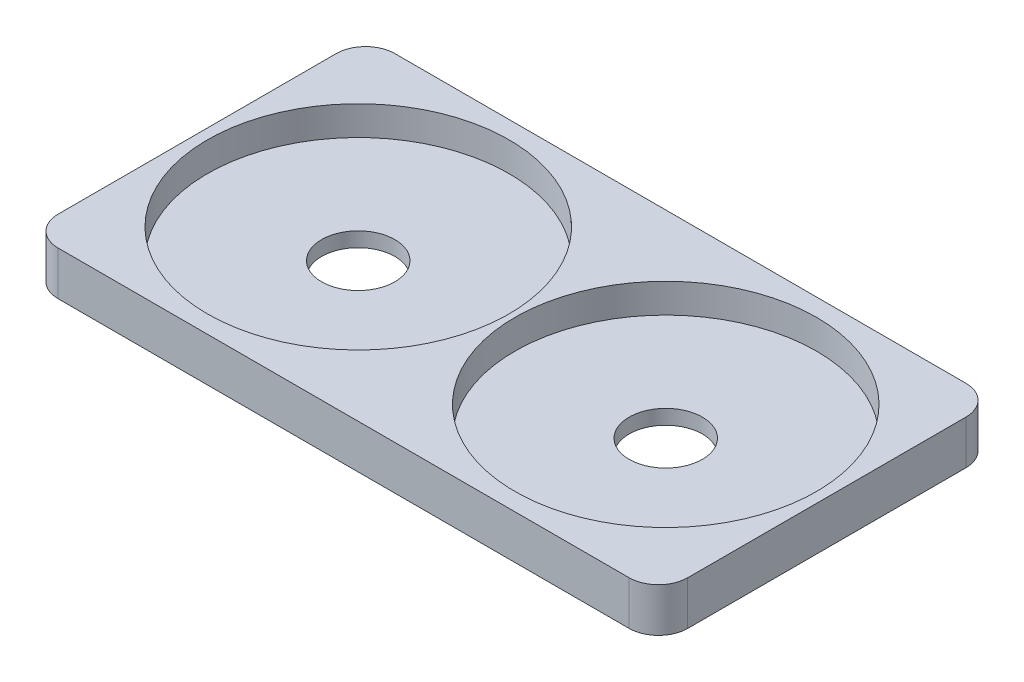
ISO-10303-21;
HEADER;
FILE_DESCRIPTION(('STEP AP214'),'2;1');
FILE_NAME('part.step','',(''),(''),'','','');
FILE_SCHEMA(('AUTOMOTIVE_DESIGN { 1 0 10303 214 1 1 1 1 }'));
ENDSEC;
DATA;
#1=APPLICATION_CONTEXT('core data for automotive mechanical design processes');
#2=APPLICATION_PROTOCOL_DEFINITION('international standard','automotive_design',2000,#1);
#3=PRODUCT_CONTEXT('',#1,'mechanical');
#4=PRODUCT('Part','Part','',(#3));
#5=PRODUCT_RELATED_PRODUCT_CATEGORY('part','',(#4));
#6=PRODUCT_DEFINITION_FORMATION('','',#4);
#7=PRODUCT_DEFINITION_CONTEXT('part definition',#1,'design');
#8=PRODUCT_DEFINITION('design','',#6,#7);
#9=PRODUCT_DEFINITION_SHAPE('','',#8);
#10=(LENGTH_UNIT() NAMED_UNIT(*) SI_UNIT(.MILLI.,.METRE.));
#11=(NAMED_UNIT(*) PLANE_ANGLE_UNIT() SI_UNIT($,.RADIAN.));
#12=(NAMED_UNIT(*) SI_UNIT($,.STERADIAN.) SOLID_ANGLE_UNIT());
#13=UNCERTAINTY_MEASURE_WITH_UNIT(LENGTH_MEASURE(1.E-05),#10,'distance_accuracy_value','');
#14=(GEOMETRIC_REPRESENTATION_CONTEXT(3) GLOBAL_UNCERTAINTY_ASSIGNED_CONTEXT((#13)) GLOBAL_UNIT_ASSIGNED_CONTEXT((#10,
#11,#12)) REPRESENTATION_CONTEXT('',''));
#15=CARTESIAN_POINT('',(0.,0.,0.));
#16=DIRECTION('',(0.,0.,1.));
#17=DIRECTION('',(1.,0.,0.));
#18=AXIS2_PLACEMENT_3D('',#15,#16,#17);
#19=CARTESIAN_POINT('',(21.5,3.,11.5));
#20=DIRECTION('',(-1.,0.,0.));
#21=DIRECTION('',(0.,0.,1.));
#22=AXIS2_PLACEMENT_3D('',#19,#20,#21);
#23=PLANE('',#22);
#24=DIRECTION('',(0.,0.,-1.));
#25=VECTOR('',#24,1.);
#26=CARTESIAN_POINT('',(21.5,0.,11.5));
#27=LINE('',#26,#25);
#28=CARTESIAN_POINT('',(21.5,0.,9.5));
#29=VERTEX_POINT('',#28);
#30=CARTESIAN_POINT('',(21.5,0.,-9.5));
#31=VERTEX_POINT('',#30);
#32=EDGE_CURVE('E127',#29,#31,#27,.T.);
#33=ORIENTED_EDGE('',*,*,#32,.T.);
#34=DIRECTION('',(0.,-1.,0.));
#35=VECTOR('',#34,1.);
#36=CARTESIAN_POINT('',(21.5,3.,-9.5));
#37=LINE('',#36,#35);
#38=CARTESIAN_POINT('',(21.5,3.,-9.5));
#39=VERTEX_POINT('',#38);
#40=EDGE_CURVE('E150',#31,#39,#37,.F.);
#41=ORIENTED_EDGE('',*,*,#40,.T.);
#42=DIRECTION('',(0.,0.,-1.));
#43=VECTOR('',#42,1.);
#44=CARTESIAN_POINT('',(21.5,3.,11.5));
#45=LINE('',#44,#43);
#46=CARTESIAN_POINT('',(21.5,3.,9.5));
#47=VERTEX_POINT('',#46);
#48=EDGE_CURVE('E125',#47,#39,#45,.T.);
#49=ORIENTED_EDGE('',*,*,#48,.F.);
#50=DIRECTION('',(0.,-1.,0.));
#51=VECTOR('',#50,1.);
#52=CARTESIAN_POINT('',(21.5,3.,9.5));
#53=LINE('',#52,#51);
#54=EDGE_CURVE('E147',#47,#29,#53,.T.);
#55=ORIENTED_EDGE('',*,*,#54,.T.);
#56=EDGE_LOOP('',(#33,#41,#49,#55));
#57=FACE_BOUND('',#56,.T.);
#58=ADVANCED_FACE('F32',(#57),#23,.F.);
#59=CARTESIAN_POINT('',(-21.5,3.,-11.5));
#60=DIRECTION('',(0.,0.,1.));
#61=DIRECTION('',(1.,0.,0.));
#62=AXIS2_PLACEMENT_3D('',#59,#60,#61);
#63=PLANE('',#62);
#64=DIRECTION('',(-1.,0.,0.));
#65=VECTOR('',#64,1.);
#66=CARTESIAN_POINT('',(-21.5,0.,-11.5));
#67=LINE('',#66,#65);
#68=CARTESIAN_POINT('',(19.5,0.,-11.5));
#69=VERTEX_POINT('',#68);
#70=CARTESIAN_POINT('',(-19.5,0.,-11.5));
#71=VERTEX_POINT('',#70);
#72=EDGE_CURVE('E123',#69,#71,#67,.T.);
#73=ORIENTED_EDGE('',*,*,#72,.T.);
#74=DIRECTION('',(0.,-1.,0.));
#75=VECTOR('',#74,1.);
#76=CARTESIAN_POINT('',(-19.5,3.,-11.5));
#77=LINE('',#76,#75);
#78=CARTESIAN_POINT('',(-19.5,3.,-11.5));
#79=VERTEX_POINT('',#78);
#80=EDGE_CURVE('E102',#71,#79,#77,.F.);
#81=ORIENTED_EDGE('',*,*,#80,.T.);
#82=DIRECTION('',(-1.,0.,0.));
#83=VECTOR('',#82,1.);
#84=CARTESIAN_POINT('',(-21.5,3.,-11.5));
#85=LINE('',#84,#83);
#86=CARTESIAN_POINT('',(19.5,3.,-11.5));
#87=VERTEX_POINT('',#86);
#88=EDGE_CURVE('E166',#87,#79,#85,.T.);
#89=ORIENTED_EDGE('',*,*,#88,.F.);
#90=DIRECTION('',(0.,-1.,0.));
#91=VECTOR('',#90,1.);
#92=CARTESIAN_POINT('',(19.5,3.,-11.5));
#93=LINE('',#92,#91);
#94=EDGE_CURVE('E107',#87,#69,#93,.T.);
#95=ORIENTED_EDGE('',*,*,#94,.T.);
#96=EDGE_LOOP('',(#73,#81,#89,#95));
#97=FACE_BOUND('',#96,.T.);
#98=ADVANCED_FACE('F225',(#97),#63,.F.);
#99=CARTESIAN_POINT('',(-21.5,3.,11.5));
#100=DIRECTION('',(1.,0.,0.));
#101=DIRECTION('',(0.,0.,-1.));
#102=AXIS2_PLACEMENT_3D('',#99,#100,#101);
#103=PLANE('',#102);
#104=DIRECTION('',(0.,0.,1.));
#105=VECTOR('',#104,1.);
#106=CARTESIAN_POINT('',(-21.5,3.,11.5));
#107=LINE('',#106,#105);
#108=CARTESIAN_POINT('',(-21.5,3.,-9.5));
#109=VERTEX_POINT('',#108);
#110=CARTESIAN_POINT('',(-21.5,3.,9.5));
#111=VERTEX_POINT('',#110);
#112=EDGE_CURVE('E116',#109,#111,#107,.T.);
#113=ORIENTED_EDGE('',*,*,#112,.F.);
#114=DIRECTION('',(0.,-1.,0.));
#115=VECTOR('',#114,1.);
#116=CARTESIAN_POINT('',(-21.5,3.,-9.5));
#117=LINE('',#116,#115);
#118=CARTESIAN_POINT('',(-21.5,0.,-9.5));
#119=VERTEX_POINT('',#118);
#120=EDGE_CURVE('E101',#109,#119,#117,.T.);
#121=ORIENTED_EDGE('',*,*,#120,.T.);
#122=DIRECTION('',(0.,0.,1.));
#123=VECTOR('',#122,1.);
#124=CARTESIAN_POINT('',(-21.5,0.,11.5));
#125=LINE('',#124,#123);
#126=CARTESIAN_POINT('',(-21.5,0.,9.5));
#127=VERTEX_POINT('',#126);
#128=EDGE_CURVE('E114',#119,#127,#125,.T.);
#129=ORIENTED_EDGE('',*,*,#128,.T.);
#130=DIRECTION('',(0.,-1.,0.));
#131=VECTOR('',#130,1.);
#132=CARTESIAN_POINT('',(-21.5,3.,9.5));
#133=LINE('',#132,#131);
#134=EDGE_CURVE('E118',#127,#111,#133,.F.);
#135=ORIENTED_EDGE('',*,*,#134,.T.);
#136=EDGE_LOOP('',(#113,#121,#129,#135));
#137=FACE_BOUND('',#136,.T.);
#138=ADVANCED_FACE('F113',(#137),#103,.F.);
#139=CARTESIAN_POINT('',(-21.5,3.,11.5));
#140=DIRECTION('',(0.,0.,-1.));
#141=DIRECTION('',(-1.,0.,0.));
#142=AXIS2_PLACEMENT_3D('',#139,#140,#141);
#143=PLANE('',#142);
#144=DIRECTION('',(1.,0.,0.));
#145=VECTOR('',#144,1.);
#146=CARTESIAN_POINT('',(-21.5,0.,11.5));
#147=LINE('',#146,#145);
#148=CARTESIAN_POINT('',(-19.5,0.,11.5));
#149=VERTEX_POINT('',#148);
#150=CARTESIAN_POINT('',(19.5,0.,11.5));
#151=VERTEX_POINT('',#150);
#152=EDGE_CURVE('E122',#149,#151,#147,.T.);
#153=ORIENTED_EDGE('',*,*,#152,.T.);
#154=DIRECTION('',(0.,-1.,0.));
#155=VECTOR('',#154,1.);
#156=CARTESIAN_POINT('',(19.5,3.,11.5));
#157=LINE('',#156,#155);
#158=CARTESIAN_POINT('',(19.5,3.,11.5));
#159=VERTEX_POINT('',#158);
#160=EDGE_CURVE('E11',#151,#159,#157,.F.);
#161=ORIENTED_EDGE('',*,*,#160,.T.);
#162=DIRECTION('',(1.,0.,0.));
#163=VECTOR('',#162,1.);
#164=CARTESIAN_POINT('',(-21.5,3.,11.5));
#165=LINE('',#164,#163);
#166=CARTESIAN_POINT('',(-19.5,3.,11.5));
#167=VERTEX_POINT('',#166);
#168=EDGE_CURVE('E131',#167,#159,#165,.T.);
#169=ORIENTED_EDGE('',*,*,#168,.F.);
#170=DIRECTION('',(0.,-1.,0.));
#171=VECTOR('',#170,1.);
#172=CARTESIAN_POINT('',(-19.5,3.,11.5));
#173=LINE('',#172,#171);
#174=EDGE_CURVE('E40',#167,#149,#173,.T.);
#175=ORIENTED_EDGE('',*,*,#174,.T.);
#176=EDGE_LOOP('',(#153,#161,#169,#175));
#177=FACE_BOUND('',#176,.T.);
#178=ADVANCED_FACE('F153',(#177),#143,.F.);
#179=CARTESIAN_POINT('',(0.,3.,0.));
#180=DIRECTION('',(0.,-1.,0.));
#181=DIRECTION('',(0.,0.,-1.));
#182=AXIS2_PLACEMENT_3D('',#179,#180,#181);
#183=PLANE('',#182);
#184=CARTESIAN_POINT('',(10.500000000002,3.,0.));
#185=DIRECTION('',(0.,1.,0.));
#186=DIRECTION('',(0.,0.,-1.));
#187=AXIS2_PLACEMENT_3D('',#184,#185,#186);
#188=CIRCLE('',#187,10.3);
#189=CARTESIAN_POINT('',(10.500000000002,3.,-10.3));
#190=VERTEX_POINT('',#189);
#191=EDGE_CURVE('E182',#190,#190,#188,.T.);
#192=ORIENTED_EDGE('',*,*,#191,.F.);
#193=EDGE_LOOP('',(#192));
#194=FACE_BOUND('',#193,.T.);
#195=CARTESIAN_POINT('',(-10.500000000002,3.,0.));
#196=DIRECTION('',(0.,1.,0.));
#197=DIRECTION('',(0.,0.,1.));
#198=AXIS2_PLACEMENT_3D('',#195,#196,#197);
#199=CIRCLE('',#198,10.3);
#200=CARTESIAN_POINT('',(-10.500000000002,3.,10.3));
#201=VERTEX_POINT('',#200);
#202=EDGE_CURVE('E171',#201,#201,#199,.T.);
#203=ORIENTED_EDGE('',*,*,#202,.F.);
#204=EDGE_LOOP('',(#203));
#205=FACE_BOUND('',#204,.T.);
#206=ORIENTED_EDGE('',*,*,#88,.T.);
#207=CARTESIAN_POINT('',(-19.5,3.,-9.5));
#208=DIRECTION('',(0.,-1.,0.));
#209=DIRECTION('',(0.,0.,-1.));
#210=AXIS2_PLACEMENT_3D('',#207,#208,#209);
#211=CIRCLE('',#210,2.);
#212=EDGE_CURVE('E145',#79,#109,#211,.F.);
#213=ORIENTED_EDGE('',*,*,#212,.T.);
#214=ORIENTED_EDGE('',*,*,#112,.T.);
#215=CARTESIAN_POINT('',(-19.5,3.,9.5));
#216=DIRECTION('',(0.,-1.,0.));
#217=DIRECTION('',(0.,0.,-1.));
#218=AXIS2_PLACEMENT_3D('',#215,#216,#217);
#219=CIRCLE('',#218,2.);
#220=EDGE_CURVE('E52',#111,#167,#219,.F.);
#221=ORIENTED_EDGE('',*,*,#220,.T.);
#222=ORIENTED_EDGE('',*,*,#168,.T.);
#223=CARTESIAN_POINT('',(19.5,3.,9.5));
#224=DIRECTION('',(0.,-1.,0.));
#225=DIRECTION('',(0.,0.,-1.));
#226=AXIS2_PLACEMENT_3D('',#223,#224,#225);
#227=CIRCLE('',#226,2.);
#228=EDGE_CURVE('E141',#159,#47,#227,.F.);
#229=ORIENTED_EDGE('',*,*,#228,.T.);
#230=ORIENTED_EDGE('',*,*,#48,.T.);
#231=CARTESIAN_POINT('',(19.5,3.,-9.5));
#232=DIRECTION('',(0.,-1.,0.));
#233=DIRECTION('',(0.,0.,-1.));
#234=AXIS2_PLACEMENT_3D('',#231,#232,#233);
#235=CIRCLE('',#234,2.);
#236=EDGE_CURVE('E143',#39,#87,#235,.F.);
#237=ORIENTED_EDGE('',*,*,#236,.T.);
#238=EDGE_LOOP('',(#206,#213,#214,#221,#222,#229,#230,#237));
#239=FACE_BOUND('',#238,.T.);
#240=ADVANCED_FACE('F217',(#194,#205,#239),#183,.F.);
#241=CARTESIAN_POINT('',(0.,0.,0.));
#242=DIRECTION('',(0.,-1.,0.));
#243=DIRECTION('',(0.,0.,-1.));
#244=AXIS2_PLACEMENT_3D('',#241,#242,#243);
#245=PLANE('',#244);
#246=CARTESIAN_POINT('',(10.500000000002,0.,0.));
#247=DIRECTION('',(0.,-1.,0.));
#248=DIRECTION('',(0.,0.,-1.));
#249=AXIS2_PLACEMENT_3D('',#246,#247,#248);
#250=CIRCLE('',#249,2.5);
#251=CARTESIAN_POINT('',(10.500000000002,0.,-2.5));
#252=VERTEX_POINT('',#251);
#253=EDGE_CURVE('E193',#252,#252,#250,.F.);
#254=ORIENTED_EDGE('',*,*,#253,.T.);
#255=EDGE_LOOP('',(#254));
#256=FACE_BOUND('',#255,.T.);
#257=CARTESIAN_POINT('',(-10.500000000002,0.,0.));
#258=DIRECTION('',(0.,-1.,0.));
#259=DIRECTION('',(0.,0.,-1.));
#260=AXIS2_PLACEMENT_3D('',#257,#258,#259);
#261=CIRCLE('',#260,2.5);
#262=CARTESIAN_POINT('',(-10.500000000002,0.,-2.5));
#263=VERTEX_POINT('',#262);
#264=EDGE_CURVE('E185',#263,#263,#261,.F.);
#265=ORIENTED_EDGE('',*,*,#264,.T.);
#266=EDGE_LOOP('',(#265));
#267=FACE_BOUND('',#266,.T.);
#268=ORIENTED_EDGE('',*,*,#128,.F.);
#269=CARTESIAN_POINT('',(-19.5,0.,-9.5));
#270=DIRECTION('',(0.,-1.,0.));
#271=DIRECTION('',(0.,0.,-1.));
#272=AXIS2_PLACEMENT_3D('',#269,#270,#271);
#273=CIRCLE('',#272,2.);
#274=EDGE_CURVE('E97',#119,#71,#273,.T.);
#275=ORIENTED_EDGE('',*,*,#274,.T.);
#276=ORIENTED_EDGE('',*,*,#72,.F.);
#277=CARTESIAN_POINT('',(19.5,0.,-9.5));
#278=DIRECTION('',(0.,-1.,0.));
#279=DIRECTION('',(0.,0.,-1.));
#280=AXIS2_PLACEMENT_3D('',#277,#278,#279);
#281=CIRCLE('',#280,2.);
#282=EDGE_CURVE('E108',#69,#31,#281,.T.);
#283=ORIENTED_EDGE('',*,*,#282,.T.);
#284=ORIENTED_EDGE('',*,*,#32,.F.);
#285=CARTESIAN_POINT('',(19.5,0.,9.5));
#286=DIRECTION('',(0.,-1.,0.));
#287=DIRECTION('',(0.,0.,-1.));
#288=AXIS2_PLACEMENT_3D('',#285,#286,#287);
#289=CIRCLE('',#288,2.);
#290=EDGE_CURVE('E134',#29,#151,#289,.T.);
#291=ORIENTED_EDGE('',*,*,#290,.T.);
#292=ORIENTED_EDGE('',*,*,#152,.F.);
#293=CARTESIAN_POINT('',(-19.5,0.,9.5));
#294=DIRECTION('',(0.,-1.,0.));
#295=DIRECTION('',(0.,0.,-1.));
#296=AXIS2_PLACEMENT_3D('',#293,#294,#295);
#297=CIRCLE('',#296,2.);
#298=EDGE_CURVE('E117',#149,#127,#297,.T.);
#299=ORIENTED_EDGE('',*,*,#298,.T.);
#300=EDGE_LOOP('',(#268,#275,#276,#283,#284,#291,#292,#299));
#301=FACE_BOUND('',#300,.T.);
#302=ADVANCED_FACE('F120',(#256,#267,#301),#245,.T.);
#303=CARTESIAN_POINT('',(-19.5,3.,-9.5));
#304=DIRECTION('',(0.,-1.,0.));
#305=DIRECTION('',(0.,0.,-1.));
#306=AXIS2_PLACEMENT_3D('',#303,#304,#305);
#307=CYLINDRICAL_SURFACE('',#306,2.);
#308=ORIENTED_EDGE('',*,*,#212,.F.);
#309=ORIENTED_EDGE('',*,*,#80,.F.);
#310=ORIENTED_EDGE('',*,*,#274,.F.);
#311=ORIENTED_EDGE('',*,*,#120,.F.);
#312=EDGE_LOOP('',(#308,#309,#310,#311));
#313=FACE_BOUND('',#312,.T.);
#314=ADVANCED_FACE('F100',(#313),#307,.T.);
#315=CARTESIAN_POINT('',(19.5,3.,-9.5));
#316=DIRECTION('',(0.,-1.,0.));
#317=DIRECTION('',(0.,0.,-1.));
#318=AXIS2_PLACEMENT_3D('',#315,#316,#317);
#319=CYLINDRICAL_SURFACE('',#318,2.);
#320=ORIENTED_EDGE('',*,*,#236,.F.);
#321=ORIENTED_EDGE('',*,*,#40,.F.);
#322=ORIENTED_EDGE('',*,*,#282,.F.);
#323=ORIENTED_EDGE('',*,*,#94,.F.);
#324=EDGE_LOOP('',(#320,#321,#322,#323));
#325=FACE_BOUND('',#324,.T.);
#326=ADVANCED_FACE('F227',(#325),#319,.T.);
#327=CARTESIAN_POINT('',(19.5,3.,9.5));
#328=DIRECTION('',(0.,-1.,0.));
#329=DIRECTION('',(0.,0.,-1.));
#330=AXIS2_PLACEMENT_3D('',#327,#328,#329);
#331=CYLINDRICAL_SURFACE('',#330,2.);
#332=ORIENTED_EDGE('',*,*,#228,.F.);
#333=ORIENTED_EDGE('',*,*,#160,.F.);
#334=ORIENTED_EDGE('',*,*,#290,.F.);
#335=ORIENTED_EDGE('',*,*,#54,.F.);
#336=EDGE_LOOP('',(#332,#333,#334,#335));
#337=FACE_BOUND('',#336,.T.);
#338=ADVANCED_FACE('F160',(#337),#331,.T.);
#339=CARTESIAN_POINT('',(-19.5,3.,9.5));
#340=DIRECTION('',(0.,-1.,0.));
#341=DIRECTION('',(0.,0.,-1.));
#342=AXIS2_PLACEMENT_3D('',#339,#340,#341);
#343=CYLINDRICAL_SURFACE('',#342,2.);
#344=ORIENTED_EDGE('',*,*,#220,.F.);
#345=ORIENTED_EDGE('',*,*,#134,.F.);
#346=ORIENTED_EDGE('',*,*,#298,.F.);
#347=ORIENTED_EDGE('',*,*,#174,.F.);
#348=EDGE_LOOP('',(#344,#345,#346,#347));
#349=FACE_BOUND('',#348,.T.);
#350=ADVANCED_FACE('F34',(#349),#343,.T.);
#351=CARTESIAN_POINT('',(-10.500000000002,1.,0.));
#352=DIRECTION('',(0.,1.,0.));
#353=DIRECTION('',(0.,0.,1.));
#354=AXIS2_PLACEMENT_3D('',#351,#352,#353);
#355=CYLINDRICAL_SURFACE('',#354,10.3);
#356=CARTESIAN_POINT('',(-10.500000000002,1.,0.));
#357=DIRECTION('',(0.,1.,0.));
#358=DIRECTION('',(0.,0.,1.));
#359=AXIS2_PLACEMENT_3D('',#356,#357,#358);
#360=CIRCLE('',#359,10.3);
#361=CARTESIAN_POINT('',(-10.500000000002,1.,10.3));
#362=VERTEX_POINT('',#361);
#363=EDGE_CURVE('E175',#362,#362,#360,.T.);
#364=ORIENTED_EDGE('',*,*,#363,.F.);
#365=EDGE_LOOP('',(#364));
#366=FACE_BOUND('',#365,.T.);
#367=ORIENTED_EDGE('',*,*,#202,.T.);
#368=EDGE_LOOP('',(#367));
#369=FACE_BOUND('',#368,.T.);
#370=ADVANCED_FACE('F249',(#366,#369),#355,.F.);
#371=CARTESIAN_POINT('',(-10.500000000002,1.,0.));
#372=DIRECTION('',(0.,1.,0.));
#373=DIRECTION('',(0.,0.,1.));
#374=AXIS2_PLACEMENT_3D('',#371,#372,#373);
#375=PLANE('',#374);
#376=CARTESIAN_POINT('',(-10.500000000002,1.,0.));
#377=DIRECTION('',(0.,1.,0.));
#378=DIRECTION('',(0.,0.,1.));
#379=AXIS2_PLACEMENT_3D('',#376,#377,#378);
#380=CIRCLE('',#379,2.5);
#381=CARTESIAN_POINT('',(-10.500000000002,1.,2.5));
#382=VERTEX_POINT('',#381);
#383=EDGE_CURVE('E190',#382,#382,#380,.T.);
#384=ORIENTED_EDGE('',*,*,#383,.F.);
#385=EDGE_LOOP('',(#384));
#386=FACE_BOUND('',#385,.T.);
#387=ORIENTED_EDGE('',*,*,#363,.T.);
#388=EDGE_LOOP('',(#387));
#389=FACE_BOUND('',#388,.T.);
#390=ADVANCED_FACE('F213',(#386,#389),#375,.T.);
#391=CARTESIAN_POINT('',(10.500000000002,1.,0.));
#392=DIRECTION('',(0.,1.,0.));
#393=DIRECTION('',(0.,0.,1.));
#394=AXIS2_PLACEMENT_3D('',#391,#392,#393);
#395=CYLINDRICAL_SURFACE('',#394,10.3);
#396=CARTESIAN_POINT('',(10.500000000002,1.,0.));
#397=DIRECTION('',(0.,1.,0.));
#398=DIRECTION('',(0.,0.,-1.));
#399=AXIS2_PLACEMENT_3D('',#396,#397,#398);
#400=CIRCLE('',#399,10.3);
#401=CARTESIAN_POINT('',(10.500000000002,1.,-10.3));
#402=VERTEX_POINT('',#401);
#403=EDGE_CURVE('E180',#402,#402,#400,.T.);
#404=ORIENTED_EDGE('',*,*,#403,.F.);
#405=EDGE_LOOP('',(#404));
#406=FACE_BOUND('',#405,.T.);
#407=ORIENTED_EDGE('',*,*,#191,.T.);
#408=EDGE_LOOP('',(#407));
#409=FACE_BOUND('',#408,.T.);
#410=ADVANCED_FACE('F207',(#406,#409),#395,.F.);
#411=CARTESIAN_POINT('',(10.500000000002,1.,0.));
#412=DIRECTION('',(0.,-1.,0.));
#413=DIRECTION('',(0.,0.,-1.));
#414=AXIS2_PLACEMENT_3D('',#411,#412,#413);
#415=PLANE('',#414);
#416=CARTESIAN_POINT('',(10.500000000002,1.,0.));
#417=DIRECTION('',(0.,1.,0.));
#418=DIRECTION('',(0.,0.,1.));
#419=AXIS2_PLACEMENT_3D('',#416,#417,#418);
#420=CIRCLE('',#419,2.5);
#421=CARTESIAN_POINT('',(10.500000000002,1.,2.5));
#422=VERTEX_POINT('',#421);
#423=EDGE_CURVE('E196',#422,#422,#420,.T.);
#424=ORIENTED_EDGE('',*,*,#423,.F.);
#425=EDGE_LOOP('',(#424));
#426=FACE_BOUND('',#425,.T.);
#427=ORIENTED_EDGE('',*,*,#403,.T.);
#428=EDGE_LOOP('',(#427));
#429=FACE_BOUND('',#428,.T.);
#430=ADVANCED_FACE('F203',(#426,#429),#415,.F.);
#431=CARTESIAN_POINT('',(-10.500000000002,-7.07106781186548,0.));
#432=DIRECTION('',(0.,1.,0.));
#433=DIRECTION('',(0.,0.,1.));
#434=AXIS2_PLACEMENT_3D('',#431,#432,#433);
#435=CYLINDRICAL_SURFACE('',#434,2.5);
#436=ORIENTED_EDGE('',*,*,#383,.T.);
#437=EDGE_LOOP('',(#436));
#438=FACE_BOUND('',#437,.T.);
#439=ORIENTED_EDGE('',*,*,#264,.F.);
#440=EDGE_LOOP('',(#439));
#441=FACE_BOUND('',#440,.T.);
#442=ADVANCED_FACE('F206',(#438,#441),#435,.F.);
#443=CARTESIAN_POINT('',(10.500000000002,-7.07106781186548,0.));
#444=DIRECTION('',(0.,1.,0.));
#445=DIRECTION('',(0.,0.,1.));
#446=AXIS2_PLACEMENT_3D('',#443,#444,#445);
#447=CYLINDRICAL_SURFACE('',#446,2.5);
#448=ORIENTED_EDGE('',*,*,#423,.T.);
#449=EDGE_LOOP('',(#448));
#450=FACE_BOUND('',#449,.T.);
#451=ORIENTED_EDGE('',*,*,#253,.F.);
#452=EDGE_LOOP('',(#451));
#453=FACE_BOUND('',#452,.T.);
#454=ADVANCED_FACE('F200',(#450,#453),#447,.F.);
#455=CLOSED_SHELL('',(#58,#98,#138,#178,#240,#302,#314,#326,#338,#350,#370,#390,#410,#430,#442,#454));
#456=MANIFOLD_SOLID_BREP('B2',#455);
#457=ADVANCED_BREP_SHAPE_REPRESENTATION('',(#18,#456),#14);
#458=SHAPE_DEFINITION_REPRESENTATION(#9,#457);
ENDSEC;
END-ISO-10303-21;
